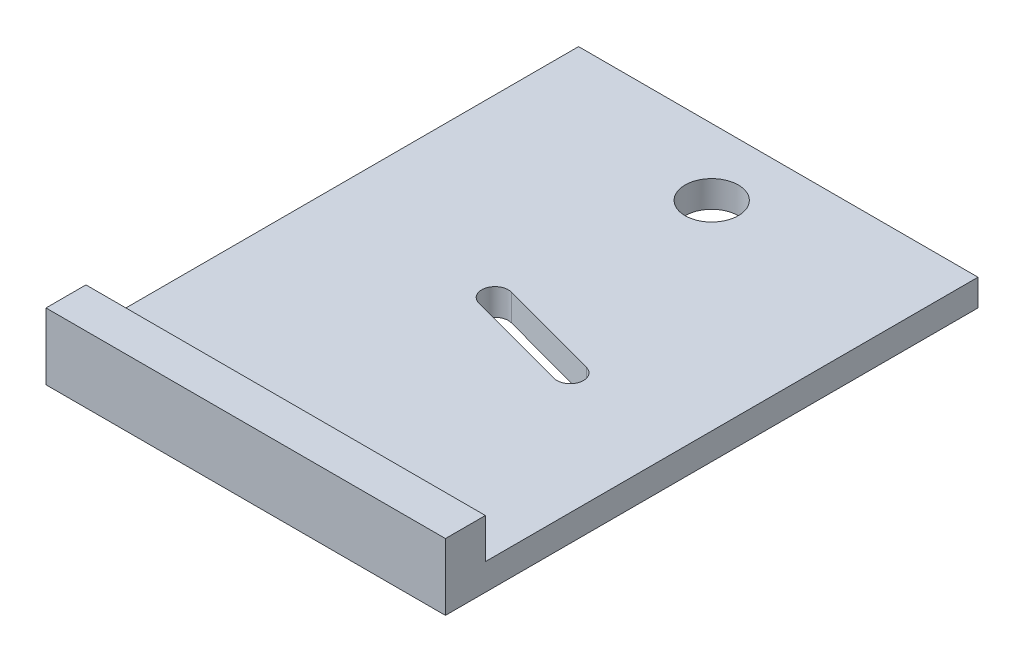
ISO-10303-21;
HEADER;
FILE_DESCRIPTION(('STEP AP214'),'2;1');
FILE_NAME('part.step','',(''),(''),'','','');
FILE_SCHEMA(('AUTOMOTIVE_DESIGN { 1 0 10303 214 1 1 1 1 }'));
ENDSEC;
DATA;
#1=APPLICATION_CONTEXT('core data for automotive mechanical design processes');
#2=APPLICATION_PROTOCOL_DEFINITION('international standard','automotive_design',2000,#1);
#3=PRODUCT_CONTEXT('',#1,'mechanical');
#4=PRODUCT('Part','Part','',(#3));
#5=PRODUCT_RELATED_PRODUCT_CATEGORY('part','',(#4));
#6=PRODUCT_DEFINITION_FORMATION('','',#4);
#7=PRODUCT_DEFINITION_CONTEXT('part definition',#1,'design');
#8=PRODUCT_DEFINITION('design','',#6,#7);
#9=PRODUCT_DEFINITION_SHAPE('','',#8);
#10=(LENGTH_UNIT() NAMED_UNIT(*) SI_UNIT(.MILLI.,.METRE.));
#11=(NAMED_UNIT(*) PLANE_ANGLE_UNIT() SI_UNIT($,.RADIAN.));
#12=(NAMED_UNIT(*) SI_UNIT($,.STERADIAN.) SOLID_ANGLE_UNIT());
#13=UNCERTAINTY_MEASURE_WITH_UNIT(LENGTH_MEASURE(1.E-05),#10,'distance_accuracy_value','');
#14=(GEOMETRIC_REPRESENTATION_CONTEXT(3) GLOBAL_UNCERTAINTY_ASSIGNED_CONTEXT((#13)) GLOBAL_UNIT_ASSIGNED_CONTEXT((#10,
#11,#12)) REPRESENTATION_CONTEXT('',''));
#15=CARTESIAN_POINT('',(0.,0.,0.));
#16=DIRECTION('',(0.,0.,1.));
#17=DIRECTION('',(1.,0.,0.));
#18=AXIS2_PLACEMENT_3D('',#15,#16,#17);
#19=CARTESIAN_POINT('',(0.,4.,0.));
#20=DIRECTION('',(1.,0.,0.));
#21=DIRECTION('',(0.,0.,-1.));
#22=AXIS2_PLACEMENT_3D('',#19,#20,#21);
#23=PLANE('',#22);
#24=DIRECTION('',(0.,0.,1.));
#25=VECTOR('',#24,1.);
#26=CARTESIAN_POINT('',(0.,0.,0.));
#27=LINE('',#26,#25);
#28=CARTESIAN_POINT('',(0.,0.,-80.));
#29=VERTEX_POINT('',#28);
#30=CARTESIAN_POINT('',(0.,0.,0.));
#31=VERTEX_POINT('',#30);
#32=EDGE_CURVE('E204',#29,#31,#27,.T.);
#33=ORIENTED_EDGE('',*,*,#32,.T.);
#34=DIRECTION('',(0.,-1.,0.));
#35=VECTOR('',#34,1.);
#36=CARTESIAN_POINT('',(0.,4.,0.));
#37=LINE('',#36,#35);
#38=CARTESIAN_POINT('',(0.,10.,0.));
#39=VERTEX_POINT('',#38);
#40=EDGE_CURVE('E11',#39,#31,#37,.T.);
#41=ORIENTED_EDGE('',*,*,#40,.F.);
#42=DIRECTION('',(0.,0.,1.));
#43=VECTOR('',#42,1.);
#44=CARTESIAN_POINT('',(0.,10.,-6.));
#45=LINE('',#44,#43);
#46=CARTESIAN_POINT('',(0.,10.,-6.));
#47=VERTEX_POINT('',#46);
#48=EDGE_CURVE('E194',#47,#39,#45,.T.);
#49=ORIENTED_EDGE('',*,*,#48,.F.);
#50=DIRECTION('',(0.,-1.,0.));
#51=VECTOR('',#50,1.);
#52=CARTESIAN_POINT('',(0.,0.,-6.));
#53=LINE('',#52,#51);
#54=CARTESIAN_POINT('',(0.,4.,-6.));
#55=VERTEX_POINT('',#54);
#56=EDGE_CURVE('E179',#47,#55,#53,.T.);
#57=ORIENTED_EDGE('',*,*,#56,.T.);
#58=DIRECTION('',(0.,0.,1.));
#59=VECTOR('',#58,1.);
#60=CARTESIAN_POINT('',(0.,4.,0.));
#61=LINE('',#60,#59);
#62=CARTESIAN_POINT('',(0.,4.,-80.));
#63=VERTEX_POINT('',#62);
#64=EDGE_CURVE('E205',#63,#55,#61,.T.);
#65=ORIENTED_EDGE('',*,*,#64,.F.);
#66=DIRECTION('',(0.,-1.,0.));
#67=VECTOR('',#66,1.);
#68=CARTESIAN_POINT('',(0.,4.,-80.));
#69=LINE('',#68,#67);
#70=EDGE_CURVE('E215',#63,#29,#69,.T.);
#71=ORIENTED_EDGE('',*,*,#70,.T.);
#72=EDGE_LOOP('',(#33,#41,#49,#57,#65,#71));
#73=FACE_BOUND('',#72,.T.);
#74=ADVANCED_FACE('F45',(#73),#23,.F.);
#75=CARTESIAN_POINT('',(0.,4.,0.));
#76=DIRECTION('',(0.,0.,-1.));
#77=DIRECTION('',(-1.,0.,0.));
#78=AXIS2_PLACEMENT_3D('',#75,#76,#77);
#79=PLANE('',#78);
#80=DIRECTION('',(1.,0.,0.));
#81=VECTOR('',#80,1.);
#82=CARTESIAN_POINT('',(0.,0.,0.));
#83=LINE('',#82,#81);
#84=CARTESIAN_POINT('',(60.,0.,0.));
#85=VERTEX_POINT('',#84);
#86=EDGE_CURVE('E218',#31,#85,#83,.T.);
#87=ORIENTED_EDGE('',*,*,#86,.T.);
#88=DIRECTION('',(0.,-1.,0.));
#89=VECTOR('',#88,1.);
#90=CARTESIAN_POINT('',(60.,4.,0.));
#91=LINE('',#90,#89);
#92=CARTESIAN_POINT('',(60.,10.,0.));
#93=VERTEX_POINT('',#92);
#94=EDGE_CURVE('E53',#93,#85,#91,.T.);
#95=ORIENTED_EDGE('',*,*,#94,.F.);
#96=DIRECTION('',(-1.,0.,0.));
#97=VECTOR('',#96,1.);
#98=CARTESIAN_POINT('',(0.,10.,0.));
#99=LINE('',#98,#97);
#100=EDGE_CURVE('E178',#93,#39,#99,.T.);
#101=ORIENTED_EDGE('',*,*,#100,.T.);
#102=ORIENTED_EDGE('',*,*,#40,.T.);
#103=EDGE_LOOP('',(#87,#95,#101,#102));
#104=FACE_BOUND('',#103,.T.);
#105=ADVANCED_FACE('F262',(#104),#79,.F.);
#106=CARTESIAN_POINT('',(60.,4.,0.));
#107=DIRECTION('',(-1.,0.,0.));
#108=DIRECTION('',(0.,0.,1.));
#109=AXIS2_PLACEMENT_3D('',#106,#107,#108);
#110=PLANE('',#109);
#111=DIRECTION('',(0.,0.,-1.));
#112=VECTOR('',#111,1.);
#113=CARTESIAN_POINT('',(60.,4.,0.));
#114=LINE('',#113,#112);
#115=CARTESIAN_POINT('',(60.,4.,-6.));
#116=VERTEX_POINT('',#115);
#117=CARTESIAN_POINT('',(60.,4.,-80.));
#118=VERTEX_POINT('',#117);
#119=EDGE_CURVE('E208',#116,#118,#114,.T.);
#120=ORIENTED_EDGE('',*,*,#119,.F.);
#121=DIRECTION('',(0.,1.,0.));
#122=VECTOR('',#121,1.);
#123=CARTESIAN_POINT('',(60.,0.,-6.));
#124=LINE('',#123,#122);
#125=CARTESIAN_POINT('',(60.,10.,-6.));
#126=VERTEX_POINT('',#125);
#127=EDGE_CURVE('E183',#116,#126,#124,.T.);
#128=ORIENTED_EDGE('',*,*,#127,.T.);
#129=DIRECTION('',(0.,0.,1.));
#130=VECTOR('',#129,1.);
#131=CARTESIAN_POINT('',(60.,10.,-6.));
#132=LINE('',#131,#130);
#133=EDGE_CURVE('E190',#126,#93,#132,.T.);
#134=ORIENTED_EDGE('',*,*,#133,.T.);
#135=ORIENTED_EDGE('',*,*,#94,.T.);
#136=DIRECTION('',(0.,0.,-1.));
#137=VECTOR('',#136,1.);
#138=CARTESIAN_POINT('',(60.,0.,0.));
#139=LINE('',#138,#137);
#140=CARTESIAN_POINT('',(60.,0.,-80.));
#141=VERTEX_POINT('',#140);
#142=EDGE_CURVE('E221',#85,#141,#139,.T.);
#143=ORIENTED_EDGE('',*,*,#142,.T.);
#144=DIRECTION('',(0.,-1.,0.));
#145=VECTOR('',#144,1.);
#146=CARTESIAN_POINT('',(60.,4.,-80.));
#147=LINE('',#146,#145);
#148=EDGE_CURVE('E229',#118,#141,#147,.T.);
#149=ORIENTED_EDGE('',*,*,#148,.F.);
#150=EDGE_LOOP('',(#120,#128,#134,#135,#143,#149));
#151=FACE_BOUND('',#150,.T.);
#152=ADVANCED_FACE('F237',(#151),#110,.F.);
#153=CARTESIAN_POINT('',(0.,4.,-80.));
#154=DIRECTION('',(0.,0.,1.));
#155=DIRECTION('',(1.,0.,0.));
#156=AXIS2_PLACEMENT_3D('',#153,#154,#155);
#157=PLANE('',#156);
#158=DIRECTION('',(-1.,0.,0.));
#159=VECTOR('',#158,1.);
#160=CARTESIAN_POINT('',(0.,0.,-80.));
#161=LINE('',#160,#159);
#162=EDGE_CURVE('E209',#141,#29,#161,.T.);
#163=ORIENTED_EDGE('',*,*,#162,.T.);
#164=ORIENTED_EDGE('',*,*,#70,.F.);
#165=DIRECTION('',(-1.,0.,0.));
#166=VECTOR('',#165,1.);
#167=CARTESIAN_POINT('',(0.,4.,-80.));
#168=LINE('',#167,#166);
#169=EDGE_CURVE('E212',#118,#63,#168,.T.);
#170=ORIENTED_EDGE('',*,*,#169,.F.);
#171=ORIENTED_EDGE('',*,*,#148,.T.);
#172=EDGE_LOOP('',(#163,#164,#170,#171));
#173=FACE_BOUND('',#172,.T.);
#174=ADVANCED_FACE('F248',(#173),#157,.F.);
#175=CARTESIAN_POINT('',(0.,4.,0.));
#176=DIRECTION('',(0.,-1.,0.));
#177=DIRECTION('',(0.,0.,-1.));
#178=AXIS2_PLACEMENT_3D('',#175,#176,#177);
#179=PLANE('',#178);
#180=DIRECTION('',(-0.965657555854744,0.,-0.259818176463162));
#181=VECTOR('',#180,1.);
#182=CARTESIAN_POINT('',(11.5682051591966,4.,-42.9951625083471));
#183=LINE('',#182,#181);
#184=CARTESIAN_POINT('',(41.2935147641686,4.,-34.9973213590273));
#185=VERTEX_POINT('',#184);
#186=CARTESIAN_POINT('',(25.8429938704927,4.,-39.1544121824379));
#187=VERTEX_POINT('',#186);
#188=EDGE_CURVE('E162',#185,#187,#183,.T.);
#189=ORIENTED_EDGE('',*,*,#188,.T.);
#190=CARTESIAN_POINT('',(26.362630223419,4.,-41.0857272941473));
#191=DIRECTION('',(0.,-1.,0.));
#192=DIRECTION('',(0.,0.,-1.));
#193=AXIS2_PLACEMENT_3D('',#190,#191,#192);
#194=CIRCLE('',#193,2.);
#195=CARTESIAN_POINT('',(26.8822665763453,4.,-43.0170424058568));
#196=VERTEX_POINT('',#195);
#197=EDGE_CURVE('E166',#187,#196,#194,.T.);
#198=ORIENTED_EDGE('',*,*,#197,.T.);
#199=DIRECTION('',(0.965657555854744,0.,0.259818176463162));
#200=VECTOR('',#199,1.);
#201=CARTESIAN_POINT('',(12.6074778650493,4.,-46.8577927317661));
#202=LINE('',#201,#200);
#203=CARTESIAN_POINT('',(42.3327874700213,4.,-38.8599515824462));
#204=VERTEX_POINT('',#203);
#205=EDGE_CURVE('E153',#196,#204,#202,.T.);
#206=ORIENTED_EDGE('',*,*,#205,.T.);
#207=CARTESIAN_POINT('',(41.8131511170949,4.,-36.9286364707367));
#208=DIRECTION('',(0.,-1.,0.));
#209=DIRECTION('',(0.,0.,-1.));
#210=AXIS2_PLACEMENT_3D('',#207,#208,#209);
#211=CIRCLE('',#210,2.);
#212=EDGE_CURVE('E128',#204,#185,#211,.T.);
#213=ORIENTED_EDGE('',*,*,#212,.T.);
#214=EDGE_LOOP('',(#189,#198,#206,#213));
#215=FACE_BOUND('',#214,.T.);
#216=CARTESIAN_POINT('',(30.,4.,-70.));
#217=DIRECTION('',(0.,1.,0.));
#218=DIRECTION('',(0.,0.,1.));
#219=AXIS2_PLACEMENT_3D('',#216,#217,#218);
#220=CIRCLE('',#219,4.);
#221=CARTESIAN_POINT('',(30.,4.,-66.));
#222=VERTEX_POINT('',#221);
#223=EDGE_CURVE('E170',#222,#222,#220,.T.);
#224=ORIENTED_EDGE('',*,*,#223,.F.);
#225=EDGE_LOOP('',(#224));
#226=FACE_BOUND('',#225,.T.);
#227=ORIENTED_EDGE('',*,*,#64,.T.);
#228=DIRECTION('',(1.,0.,0.));
#229=VECTOR('',#228,1.);
#230=CARTESIAN_POINT('',(0.,4.,-6.));
#231=LINE('',#230,#229);
#232=EDGE_CURVE('E198',#55,#116,#231,.T.);
#233=ORIENTED_EDGE('',*,*,#232,.T.);
#234=ORIENTED_EDGE('',*,*,#119,.T.);
#235=ORIENTED_EDGE('',*,*,#169,.T.);
#236=EDGE_LOOP('',(#227,#233,#234,#235));
#237=FACE_BOUND('',#236,.T.);
#238=ADVANCED_FACE('F255',(#215,#226,#237),#179,.F.);
#239=CARTESIAN_POINT('',(0.,0.,0.));
#240=DIRECTION('',(0.,-1.,0.));
#241=DIRECTION('',(0.,0.,-1.));
#242=AXIS2_PLACEMENT_3D('',#239,#240,#241);
#243=PLANE('',#242);
#244=CARTESIAN_POINT('',(26.362630223419,0.,-41.0857272941473));
#245=DIRECTION('',(0.,-1.,0.));
#246=DIRECTION('',(0.,0.,-1.));
#247=AXIS2_PLACEMENT_3D('',#244,#245,#246);
#248=CIRCLE('',#247,2.);
#249=CARTESIAN_POINT('',(25.8429938704927,0.,-39.1544121824379));
#250=VERTEX_POINT('',#249);
#251=CARTESIAN_POINT('',(26.8822665763453,0.,-43.0170424058568));
#252=VERTEX_POINT('',#251);
#253=EDGE_CURVE('E68',#250,#252,#248,.T.);
#254=ORIENTED_EDGE('',*,*,#253,.F.);
#255=DIRECTION('',(-0.965657555854743,0.,-0.259818176463162));
#256=VECTOR('',#255,1.);
#257=CARTESIAN_POINT('',(25.8429938704927,0.,-39.1544121824379));
#258=LINE('',#257,#256);
#259=CARTESIAN_POINT('',(41.2935147641686,0.,-34.9973213590273));
#260=VERTEX_POINT('',#259);
#261=EDGE_CURVE('E143',#260,#250,#258,.T.);
#262=ORIENTED_EDGE('',*,*,#261,.F.);
#263=CARTESIAN_POINT('',(41.8131511170949,0.,-36.9286364707367));
#264=DIRECTION('',(0.,-1.,0.));
#265=DIRECTION('',(0.,0.,-1.));
#266=AXIS2_PLACEMENT_3D('',#263,#264,#265);
#267=CIRCLE('',#266,2.);
#268=CARTESIAN_POINT('',(42.3327874700213,0.,-38.8599515824462));
#269=VERTEX_POINT('',#268);
#270=EDGE_CURVE('E125',#269,#260,#267,.T.);
#271=ORIENTED_EDGE('',*,*,#270,.F.);
#272=DIRECTION('',(0.965657555854743,0.,0.259818176463162));
#273=VECTOR('',#272,1.);
#274=CARTESIAN_POINT('',(26.8822665763453,0.,-43.0170424058568));
#275=LINE('',#274,#273);
#276=EDGE_CURVE('E135',#252,#269,#275,.T.);
#277=ORIENTED_EDGE('',*,*,#276,.F.);
#278=EDGE_LOOP('',(#254,#262,#271,#277));
#279=FACE_BOUND('',#278,.T.);
#280=CARTESIAN_POINT('',(30.,0.,-70.));
#281=DIRECTION('',(0.,-1.,0.));
#282=DIRECTION('',(0.,0.,-1.));
#283=AXIS2_PLACEMENT_3D('',#280,#281,#282);
#284=CIRCLE('',#283,4.);
#285=CARTESIAN_POINT('',(30.,0.,-74.));
#286=VERTEX_POINT('',#285);
#287=EDGE_CURVE('E174',#286,#286,#284,.T.);
#288=ORIENTED_EDGE('',*,*,#287,.F.);
#289=EDGE_LOOP('',(#288));
#290=FACE_BOUND('',#289,.T.);
#291=ORIENTED_EDGE('',*,*,#162,.F.);
#292=ORIENTED_EDGE('',*,*,#142,.F.);
#293=ORIENTED_EDGE('',*,*,#86,.F.);
#294=ORIENTED_EDGE('',*,*,#32,.F.);
#295=EDGE_LOOP('',(#291,#292,#293,#294));
#296=FACE_BOUND('',#295,.T.);
#297=ADVANCED_FACE('F140',(#279,#290,#296),#243,.T.);
#298=CARTESIAN_POINT('',(0.,0.,-6.));
#299=DIRECTION('',(0.,0.,-1.));
#300=DIRECTION('',(-1.,0.,0.));
#301=AXIS2_PLACEMENT_3D('',#298,#299,#300);
#302=PLANE('',#301);
#303=ORIENTED_EDGE('',*,*,#232,.F.);
#304=ORIENTED_EDGE('',*,*,#56,.F.);
#305=DIRECTION('',(-1.,0.,0.));
#306=VECTOR('',#305,1.);
#307=CARTESIAN_POINT('',(0.,10.,-6.));
#308=LINE('',#307,#306);
#309=EDGE_CURVE('E186',#126,#47,#308,.T.);
#310=ORIENTED_EDGE('',*,*,#309,.F.);
#311=ORIENTED_EDGE('',*,*,#127,.F.);
#312=EDGE_LOOP('',(#303,#304,#310,#311));
#313=FACE_BOUND('',#312,.T.);
#314=ADVANCED_FACE('F258',(#313),#302,.T.);
#315=CARTESIAN_POINT('',(0.,10.,-6.));
#316=DIRECTION('',(0.,1.,0.));
#317=DIRECTION('',(0.,0.,1.));
#318=AXIS2_PLACEMENT_3D('',#315,#316,#317);
#319=PLANE('',#318);
#320=ORIENTED_EDGE('',*,*,#100,.F.);
#321=ORIENTED_EDGE('',*,*,#133,.F.);
#322=ORIENTED_EDGE('',*,*,#309,.T.);
#323=ORIENTED_EDGE('',*,*,#48,.T.);
#324=EDGE_LOOP('',(#320,#321,#322,#323));
#325=FACE_BOUND('',#324,.T.);
#326=ADVANCED_FACE('F261',(#325),#319,.T.);
#327=CARTESIAN_POINT('',(30.,4.,-70.));
#328=DIRECTION('',(0.,1.,0.));
#329=DIRECTION('',(0.,0.,1.));
#330=AXIS2_PLACEMENT_3D('',#327,#328,#329);
#331=CYLINDRICAL_SURFACE('',#330,4.);
#332=ORIENTED_EDGE('',*,*,#287,.T.);
#333=EDGE_LOOP('',(#332));
#334=FACE_BOUND('',#333,.T.);
#335=ORIENTED_EDGE('',*,*,#223,.T.);
#336=EDGE_LOOP('',(#335));
#337=FACE_BOUND('',#336,.T.);
#338=ADVANCED_FACE('F279',(#334,#337),#331,.F.);
#339=CARTESIAN_POINT('',(26.362630223419,10.,-41.0857272941473));
#340=DIRECTION('',(0.,-1.,0.));
#341=DIRECTION('',(0.,0.,-1.));
#342=AXIS2_PLACEMENT_3D('',#339,#340,#341);
#343=CYLINDRICAL_SURFACE('',#342,2.);
#344=DIRECTION('',(0.,-1.,0.));
#345=VECTOR('',#344,1.);
#346=CARTESIAN_POINT('',(25.8429938704927,10.,-39.1544121824379));
#347=LINE('',#346,#345);
#348=EDGE_CURVE('E150',#187,#250,#347,.T.);
#349=ORIENTED_EDGE('',*,*,#348,.T.);
#350=ORIENTED_EDGE('',*,*,#253,.T.);
#351=DIRECTION('',(0.,-1.,0.));
#352=VECTOR('',#351,1.);
#353=CARTESIAN_POINT('',(26.8822665763453,10.,-43.0170424058568));
#354=LINE('',#353,#352);
#355=EDGE_CURVE('E132',#196,#252,#354,.T.);
#356=ORIENTED_EDGE('',*,*,#355,.F.);
#357=ORIENTED_EDGE('',*,*,#197,.F.);
#358=EDGE_LOOP('',(#349,#350,#356,#357));
#359=FACE_BOUND('',#358,.T.);
#360=ADVANCED_FACE('F284',(#359),#343,.F.);
#361=CARTESIAN_POINT('',(25.8429938704927,10.,-39.1544121824379));
#362=DIRECTION('',(-0.259818176463162,0.,0.965657555854744));
#363=DIRECTION('',(0.965657555854744,0.,0.259818176463162));
#364=AXIS2_PLACEMENT_3D('',#361,#362,#363);
#365=PLANE('',#364);
#366=DIRECTION('',(0.,-1.,0.));
#367=VECTOR('',#366,1.);
#368=CARTESIAN_POINT('',(41.2935147641686,10.,-34.9973213590273));
#369=LINE('',#368,#367);
#370=EDGE_CURVE('E131',#185,#260,#369,.T.);
#371=ORIENTED_EDGE('',*,*,#370,.T.);
#372=ORIENTED_EDGE('',*,*,#261,.T.);
#373=ORIENTED_EDGE('',*,*,#348,.F.);
#374=ORIENTED_EDGE('',*,*,#188,.F.);
#375=EDGE_LOOP('',(#371,#372,#373,#374));
#376=FACE_BOUND('',#375,.T.);
#377=ADVANCED_FACE('F288',(#376),#365,.F.);
#378=CARTESIAN_POINT('',(41.8131511170949,10.,-36.9286364707367));
#379=DIRECTION('',(0.,-1.,0.));
#380=DIRECTION('',(0.,0.,-1.));
#381=AXIS2_PLACEMENT_3D('',#378,#379,#380);
#382=CYLINDRICAL_SURFACE('',#381,2.);
#383=DIRECTION('',(0.,-1.,0.));
#384=VECTOR('',#383,1.);
#385=CARTESIAN_POINT('',(42.3327874700213,10.,-38.8599515824462));
#386=LINE('',#385,#384);
#387=EDGE_CURVE('E60',#204,#269,#386,.T.);
#388=ORIENTED_EDGE('',*,*,#387,.T.);
#389=ORIENTED_EDGE('',*,*,#270,.T.);
#390=ORIENTED_EDGE('',*,*,#370,.F.);
#391=ORIENTED_EDGE('',*,*,#212,.F.);
#392=EDGE_LOOP('',(#388,#389,#390,#391));
#393=FACE_BOUND('',#392,.T.);
#394=ADVANCED_FACE('F122',(#393),#382,.F.);
#395=CARTESIAN_POINT('',(26.8822665763453,10.,-43.0170424058568));
#396=DIRECTION('',(0.259818176463162,0.,-0.965657555854744));
#397=DIRECTION('',(-0.965657555854744,0.,-0.259818176463162));
#398=AXIS2_PLACEMENT_3D('',#395,#396,#397);
#399=PLANE('',#398);
#400=ORIENTED_EDGE('',*,*,#355,.T.);
#401=ORIENTED_EDGE('',*,*,#276,.T.);
#402=ORIENTED_EDGE('',*,*,#387,.F.);
#403=ORIENTED_EDGE('',*,*,#205,.F.);
#404=EDGE_LOOP('',(#400,#401,#402,#403));
#405=FACE_BOUND('',#404,.T.);
#406=ADVANCED_FACE('F136',(#405),#399,.F.);
#407=CLOSED_SHELL('',(#74,#105,#152,#174,#238,#297,#314,#326,#338,#360,#377,#394,#406));
#408=MANIFOLD_SOLID_BREP('B2',#407);
#409=ADVANCED_BREP_SHAPE_REPRESENTATION('',(#18,#408),#14);
#410=SHAPE_DEFINITION_REPRESENTATION(#9,#409);
ENDSEC;
END-ISO-10303-21;
